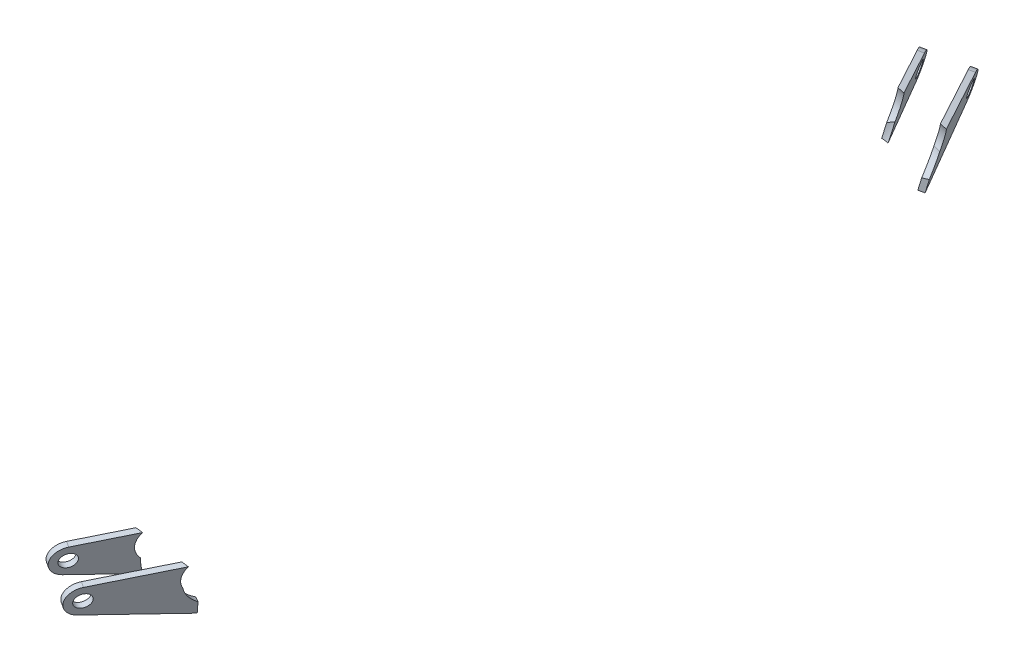
ISO-10303-21;
HEADER;
FILE_DESCRIPTION(('STEP AP214'),'2;1');
FILE_NAME('part.step','',(''),(''),'','','');
FILE_SCHEMA(('AUTOMOTIVE_DESIGN { 1 0 10303 214 1 1 1 1 }'));
ENDSEC;
DATA;
#1=APPLICATION_CONTEXT('core data for automotive mechanical design processes');
#2=APPLICATION_PROTOCOL_DEFINITION('international standard','automotive_design',2000,#1);
#3=PRODUCT_CONTEXT('',#1,'mechanical');
#4=PRODUCT('Part','Part','',(#3));
#5=PRODUCT_RELATED_PRODUCT_CATEGORY('part','',(#4));
#6=PRODUCT_DEFINITION_FORMATION('','',#4);
#7=PRODUCT_DEFINITION_CONTEXT('part definition',#1,'design');
#8=PRODUCT_DEFINITION('design','',#6,#7);
#9=PRODUCT_DEFINITION_SHAPE('','',#8);
#10=(LENGTH_UNIT() NAMED_UNIT(*) SI_UNIT(.MILLI.,.METRE.));
#11=(NAMED_UNIT(*) PLANE_ANGLE_UNIT() SI_UNIT($,.RADIAN.));
#12=(NAMED_UNIT(*) SI_UNIT($,.STERADIAN.) SOLID_ANGLE_UNIT());
#13=UNCERTAINTY_MEASURE_WITH_UNIT(LENGTH_MEASURE(1.E-05),#10,'distance_accuracy_value','');
#14=(GEOMETRIC_REPRESENTATION_CONTEXT(3) GLOBAL_UNCERTAINTY_ASSIGNED_CONTEXT((#13)) GLOBAL_UNIT_ASSIGNED_CONTEXT((#10,
#11,#12)) REPRESENTATION_CONTEXT('',''));
#15=CARTESIAN_POINT('',(0.,0.,0.));
#16=DIRECTION('',(0.,0.,1.));
#17=DIRECTION('',(1.,0.,0.));
#18=AXIS2_PLACEMENT_3D('',#15,#16,#17);
#19=CARTESIAN_POINT('',(1107.80355758936,282.911405493826,229.382502317127));
#20=DIRECTION('',(0.849703534219783,-0.242617124485415,0.468124806906063));
#21=DIRECTION('',(0.48254214233557,0.,-0.87587275381199));
#22=AXIS2_PLACEMENT_3D('',#19,#20,#21);
#23=CYLINDRICAL_SURFACE('',#22,8.00000000000001);
#24=CARTESIAN_POINT('',(1110.35266819202,282.183554120369,230.786876737845));
#25=DIRECTION('',(-0.849703534219782,0.242617124485416,-0.468124806906065));
#26=DIRECTION('',(-0.482542142335571,0.,0.875872753811989));
#27=AXIS2_PLACEMENT_3D('',#24,#25,#26);
#28=CIRCLE('',#27,8.00000000000001);
#29=CARTESIAN_POINT('',(1107.85873724563,274.605894116042,231.386357591102));
#30=VERTEX_POINT('',#29);
#31=CARTESIAN_POINT('',(1111.88115788975,289.937012839905,232.030901306901));
#32=VERTEX_POINT('',#31);
#33=EDGE_CURVE('E103',#30,#32,#28,.T.);
#34=ORIENTED_EDGE('',*,*,#33,.T.);
#35=DIRECTION('',(0.849703534219783,-0.242617124485415,0.468124806906063));
#36=VECTOR('',#35,1.);
#37=CARTESIAN_POINT('',(1109.33204728709,290.664864213361,230.626526886182));
#38=LINE('',#37,#36);
#39=CARTESIAN_POINT('',(1109.33204728709,290.664864213361,230.626526886182));
#40=VERTEX_POINT('',#39);
#41=EDGE_CURVE('E105',#40,#32,#38,.T.);
#42=ORIENTED_EDGE('',*,*,#41,.F.);
#43=CARTESIAN_POINT('',(1107.80355758936,282.911405493826,229.382502317127));
#44=DIRECTION('',(-0.849703534219782,0.242617124485416,-0.468124806906065));
#45=DIRECTION('',(-0.482542142335571,0.,0.875872753811989));
#46=AXIS2_PLACEMENT_3D('',#43,#44,#45);
#47=CIRCLE('',#46,8.00000000000001);
#48=CARTESIAN_POINT('',(1105.30962664297,275.333745489498,229.981983170384));
#49=VERTEX_POINT('',#48);
#50=EDGE_CURVE('E104',#49,#40,#47,.T.);
#51=ORIENTED_EDGE('',*,*,#50,.F.);
#52=DIRECTION('',(0.849703534219783,-0.242617124485415,0.468124806906063));
#53=VECTOR('',#52,1.);
#54=CARTESIAN_POINT('',(1105.30962664297,275.333745489498,229.981983170384));
#55=LINE('',#54,#53);
#56=EDGE_CURVE('E91',#49,#30,#55,.T.);
#57=ORIENTED_EDGE('',*,*,#56,.T.);
#58=EDGE_LOOP('',(#34,#42,#51,#57));
#59=FACE_BOUND('',#58,.T.);
#60=ADVANCED_FACE('F50',(#59),#23,.T.);
#61=CARTESIAN_POINT('',(1107.80355758936,282.911405493826,229.382502317127));
#62=DIRECTION('',(0.849703534219783,-0.242617124485415,0.468124806906063));
#63=DIRECTION('',(0.48254214233557,0.,-0.87587275381199));
#64=AXIS2_PLACEMENT_3D('',#61,#62,#63);
#65=CYLINDRICAL_SURFACE('',#64,4.1);
#66=CARTESIAN_POINT('',(1107.80355758936,282.911405493826,229.382502317127));
#67=DIRECTION('',(-0.849703534219782,0.242617124485416,-0.468124806906065));
#68=DIRECTION('',(-0.482542142335571,0.,0.875872753811989));
#69=AXIS2_PLACEMENT_3D('',#66,#67,#68);
#70=CIRCLE('',#69,4.1);
#71=CARTESIAN_POINT('',(1105.82513480579,282.911405493826,232.973580607756));
#72=VERTEX_POINT('',#71);
#73=EDGE_CURVE('E97',#72,#72,#70,.T.);
#74=ORIENTED_EDGE('',*,*,#73,.T.);
#75=EDGE_LOOP('',(#74));
#76=FACE_BOUND('',#75,.T.);
#77=CARTESIAN_POINT('',(1110.35266819202,282.183554120369,230.786876737845));
#78=DIRECTION('',(-0.849703534219782,0.242617124485416,-0.468124806906065));
#79=DIRECTION('',(-0.482542142335571,0.,0.875872753811989));
#80=AXIS2_PLACEMENT_3D('',#77,#78,#79);
#81=CIRCLE('',#80,4.1);
#82=CARTESIAN_POINT('',(1108.37424540845,282.183554120369,234.377955028474));
#83=VERTEX_POINT('',#82);
#84=EDGE_CURVE('E110',#83,#83,#81,.T.);
#85=ORIENTED_EDGE('',*,*,#84,.F.);
#86=EDGE_LOOP('',(#85));
#87=FACE_BOUND('',#86,.T.);
#88=ADVANCED_FACE('F52',(#76,#87),#65,.F.);
#89=CARTESIAN_POINT('',(933.918642447806,275.426402218324,541.125513622882));
#90=DIRECTION('',(-0.191061212215496,-0.969182339941915,-0.155503071131922));
#91=DIRECTION('',(-0.51535400454366,0.233875661315721,-0.824446738755723));
#92=AXIS2_PLACEMENT_3D('',#89,#90,#91);
#93=PLANE('',#92);
#94=CARTESIAN_POINT('',(2339.12060391884,62.0776956583833,144.311540305559));
#95=DIRECTION('',(0.191061212215496,0.969182339941915,0.155503071131922));
#96=DIRECTION('',(0.981506416473428,-0.18671975329441,-0.0422005705075714));
#97=AXIS2_PLACEMENT_3D('',#94,#95,#96);
#98=ELLIPSE('',#97,2047.60295975983,12.7);
#99=CARTESIAN_POINT('',(1126.3297099436,291.192183227583,206.455542475883));
#100=VERTEX_POINT('',#99);
#101=CARTESIAN_POINT('',(1122.91336372795,291.844696362542,206.586260423644));
#102=VERTEX_POINT('',#101);
#103=EDGE_CURVE('E126',#100,#102,#98,.F.);
#104=ORIENTED_EDGE('',*,*,#103,.T.);
#105=DIRECTION('',(0.491426003708755,0.0426910160472063,-0.869872381460465));
#106=VECTOR('',#105,1.);
#107=CARTESIAN_POINT('',(933.918642447806,275.426402218324,541.125513622882));
#108=LINE('',#107,#106);
#109=EDGE_CURVE('E141',#40,#102,#108,.T.);
#110=ORIENTED_EDGE('',*,*,#109,.F.);
#111=ORIENTED_EDGE('',*,*,#41,.T.);
#112=DIRECTION('',(0.491426003708755,0.0426910160472063,-0.869872381460465));
#113=VECTOR('',#112,1.);
#114=CARTESIAN_POINT('',(936.467753050465,274.698550844868,542.529888043601));
#115=LINE('',#114,#113);
#116=EDGE_CURVE('E98',#32,#100,#115,.T.);
#117=ORIENTED_EDGE('',*,*,#116,.T.);
#118=EDGE_LOOP('',(#104,#110,#111,#117));
#119=FACE_BOUND('',#118,.T.);
#120=ADVANCED_FACE('F125',(#119),#93,.F.);
#121=CARTESIAN_POINT('',(773.70714337,349.94360184793,209.999999999999));
#122=DIRECTION('',(0.982672570442046,-0.180704930107559,-0.0412352705295394));
#123=DIRECTION('',(0.180858756895923,0.983509079802552,0.));
#124=AXIS2_PLACEMENT_3D('',#121,#122,#123);
#125=CYLINDRICAL_SURFACE('',#124,12.7);
#126=CARTESIAN_POINT('',(1131.17026577313,284.209245875391,195.));
#127=DIRECTION('',(0.417051669287476,-0.855676898295532,-0.306406512443628));
#128=DIRECTION('',(0.908549979994918,0.383371496045263,0.166021775292435));
#129=AXIS2_PLACEMENT_3D('',#126,#127,#128);
#130=ELLIPSE('',#129,22.007155689415,12.7);
#131=CARTESIAN_POINT('',(1123.26666944262,276.913970150011,204.615301053474));
#132=VERTEX_POINT('',#131);
#133=CARTESIAN_POINT('',(1120.28212910685,275.986416561959,203.143330538669));
#134=VERTEX_POINT('',#133);
#135=EDGE_CURVE('E12',#132,#134,#130,.T.);
#136=ORIENTED_EDGE('',*,*,#135,.T.);
#137=CARTESIAN_POINT('',(1127.23212459541,284.933435750716,195.165253739377));
#138=DIRECTION('',(0.849703534219782,-0.242617124485416,0.468124806906065));
#139=DIRECTION('',(0.49370839550025,0.0544491545256872,-0.867921257824699));
#140=AXIS2_PLACEMENT_3D('',#137,#138,#139);
#141=ELLIPSE('',#140,14.7757022760264,12.7);
#142=EDGE_CURVE('E114',#134,#102,#141,.F.);
#143=ORIENTED_EDGE('',*,*,#142,.T.);
#144=ORIENTED_EDGE('',*,*,#103,.F.);
#145=CARTESIAN_POINT('',(1130.66196963533,284.302717109673,195.021329310886));
#146=DIRECTION('',(0.849703534219782,-0.242617124485416,0.468124806906065));
#147=DIRECTION('',(0.49370839550025,0.0544491545256872,-0.867921257824699));
#148=AXIS2_PLACEMENT_3D('',#145,#146,#147);
#149=ELLIPSE('',#148,14.7757022760264,12.7);
#150=EDGE_CURVE('E54',#132,#100,#149,.F.);
#151=ORIENTED_EDGE('',*,*,#150,.F.);
#152=EDGE_LOOP('',(#136,#143,#144,#151));
#153=FACE_BOUND('',#152,.T.);
#154=ADVANCED_FACE('F128',(#153),#125,.F.);
#155=CARTESIAN_POINT('',(835.2968838926,-238.503572010835,460.187791075277));
#156=DIRECTION('',(-0.849703534219782,0.242617124485416,-0.468124806906065));
#157=DIRECTION('',(-0.482542142335571,0.,0.875872753811989));
#158=AXIS2_PLACEMENT_3D('',#155,#156,#157);
#159=PLANE('',#158);
#160=ORIENTED_EDGE('',*,*,#84,.T.);
#161=EDGE_LOOP('',(#160));
#162=FACE_BOUND('',#161,.T.);
#163=CARTESIAN_POINT('',(1130.57820583632,283.256312767818,194.631046177595));
#164=DIRECTION('',(0.849703534219782,-0.242617124485416,0.468124806906065));
#165=DIRECTION('',(0.195854722962817,0.969553269268833,0.146994508548026));
#166=AXIS2_PLACEMENT_3D('',#163,#164,#165);
#167=ELLIPSE('',#166,33.7355125553886,12.7);
#168=CARTESIAN_POINT('',(1121.99795509881,267.636333238757,202.109809974439));
#169=VERTEX_POINT('',#168);
#170=EDGE_CURVE('E66',#169,#132,#167,.F.);
#171=ORIENTED_EDGE('',*,*,#170,.T.);
#172=ORIENTED_EDGE('',*,*,#150,.T.);
#173=ORIENTED_EDGE('',*,*,#116,.F.);
#174=ORIENTED_EDGE('',*,*,#33,.F.);
#175=DIRECTION('',(-0.425230788190571,0.209606492803467,0.880479355209113));
#176=VECTOR('',#175,1.);
#177=CARTESIAN_POINT('',(1018.64295583765,318.582500615348,416.115817146057));
#178=LINE('',#177,#176);
#179=EDGE_CURVE('E88',#169,#30,#178,.T.);
#180=ORIENTED_EDGE('',*,*,#179,.F.);
#181=EDGE_LOOP('',(#171,#172,#173,#174,#180));
#182=FACE_BOUND('',#181,.T.);
#183=ADVANCED_FACE('F107',(#162,#182),#159,.F.);
#184=CARTESIAN_POINT('',(832.747773289941,-237.775720637378,458.783416654559));
#185=DIRECTION('',(-0.849703534219782,0.242617124485416,-0.468124806906065));
#186=DIRECTION('',(-0.482542142335571,0.,0.875872753811989));
#187=AXIS2_PLACEMENT_3D('',#184,#185,#186);
#188=PLANE('',#187);
#189=ORIENTED_EDGE('',*,*,#73,.F.);
#190=EDGE_LOOP('',(#189));
#191=FACE_BOUND('',#190,.T.);
#192=DIRECTION('',(-0.425230788190571,0.209606492803467,0.880479355209113));
#193=VECTOR('',#192,1.);
#194=CARTESIAN_POINT('',(1016.09384523499,319.310351988804,414.711442725339));
#195=LINE('',#194,#193);
#196=CARTESIAN_POINT('',(1118.96743495081,268.601482966905,201.702238179139));
#197=VERTEX_POINT('',#196);
#198=EDGE_CURVE('E75',#197,#49,#195,.T.);
#199=ORIENTED_EDGE('',*,*,#198,.T.);
#200=ORIENTED_EDGE('',*,*,#50,.T.);
#201=ORIENTED_EDGE('',*,*,#109,.T.);
#202=ORIENTED_EDGE('',*,*,#142,.F.);
#203=CARTESIAN_POINT('',(1126.58314530644,276.826177558513,192.141445443608));
#204=DIRECTION('',(0.849703534219782,-0.242617124485416,0.468124806906065));
#205=DIRECTION('',(0.195854722962817,0.969553269268833,0.146994508548026));
#206=AXIS2_PLACEMENT_3D('',#203,#204,#205);
#207=ELLIPSE('',#206,33.7355125553886,12.7);
#208=EDGE_CURVE('E131',#197,#134,#207,.F.);
#209=ORIENTED_EDGE('',*,*,#208,.F.);
#210=EDGE_LOOP('',(#199,#200,#201,#202,#209));
#211=FACE_BOUND('',#210,.T.);
#212=ADVANCED_FACE('F142',(#191,#211),#188,.T.);
#213=CARTESIAN_POINT('',(1016.09384523499,319.310351988804,414.711442725339));
#214=DIRECTION('',(0.311741368299487,0.947207500540963,-0.0749351066570562));
#215=DIRECTION('',(0.550633493628883,-0.1158230169199,0.826672719064578));
#216=AXIS2_PLACEMENT_3D('',#213,#214,#215);
#217=PLANE('',#216);
#218=CARTESIAN_POINT('',(1120.50296248206,267.039993503082,188.352459642488));
#219=DIRECTION('',(-0.311741368299487,-0.947207500540963,0.0749351066570562));
#220=DIRECTION('',(0.501797874284253,-0.0971524805070823,0.859511657218869));
#221=AXIS2_PLACEMENT_3D('',#218,#219,#220);
#222=ELLIPSE('',#221,14.1556723375433,12.7);
#223=EDGE_CURVE('E95',#197,#169,#222,.F.);
#224=ORIENTED_EDGE('',*,*,#223,.T.);
#225=ORIENTED_EDGE('',*,*,#179,.T.);
#226=ORIENTED_EDGE('',*,*,#56,.F.);
#227=ORIENTED_EDGE('',*,*,#198,.F.);
#228=EDGE_LOOP('',(#224,#225,#226,#227));
#229=FACE_BOUND('',#228,.T.);
#230=ADVANCED_FACE('F90',(#229),#217,.F.);
#231=CARTESIAN_POINT('',(1066.45599283991,180.050242070596,154.672024944587));
#232=DIRECTION('',(0.50132402411459,0.806891719065977,0.312409949502743));
#233=DIRECTION('',(-0.849406753092849,0.527738730623652,0.));
#234=AXIS2_PLACEMENT_3D('',#231,#232,#233);
#235=CYLINDRICAL_SURFACE('',#234,12.7);
#236=ORIENTED_EDGE('',*,*,#223,.F.);
#237=ORIENTED_EDGE('',*,*,#208,.T.);
#238=ORIENTED_EDGE('',*,*,#135,.F.);
#239=ORIENTED_EDGE('',*,*,#170,.F.);
#240=EDGE_LOOP('',(#236,#237,#238,#239));
#241=FACE_BOUND('',#240,.T.);
#242=ADVANCED_FACE('F148',(#241),#235,.F.);
#243=CLOSED_SHELL('',(#60,#88,#120,#154,#183,#212,#230,#242));
#244=MANIFOLD_SOLID_BREP('B2',#243);
#245=CARTESIAN_POINT('',(853.140658111219,-243.598531625029,470.018412020306));
#246=DIRECTION('',(0.849703534219784,-0.242617124485413,0.468124806906062));
#247=DIRECTION('',(-0.482542142335568,0.,0.875872753811991));
#248=AXIS2_PLACEMENT_3D('',#245,#246,#247);
#249=PLANE('',#248);
#250=CARTESIAN_POINT('',(1128.19644241064,277.088594506176,240.617497682873));
#251=DIRECTION('',(-0.849703534219784,0.242617124485413,-0.468124806906062));
#252=DIRECTION('',(-0.482542142335568,0.,0.875872753811991));
#253=AXIS2_PLACEMENT_3D('',#250,#251,#252);
#254=CIRCLE('',#253,4.1);
#255=CARTESIAN_POINT('',(1126.21801962706,277.088594506176,244.208575973502));
#256=VERTEX_POINT('',#255);
#257=EDGE_CURVE('E329',#256,#256,#254,.T.);
#258=ORIENTED_EDGE('',*,*,#257,.T.);
#259=EDGE_LOOP('',(#258));
#260=FACE_BOUND('',#259,.T.);
#261=CARTESIAN_POINT('',(1154.67088491479,279.887686622376,194.01385831144));
#262=DIRECTION('',(-0.849703534219784,0.242617124485413,-0.468124806906062));
#263=DIRECTION('',(0.493708395500246,0.0544491545256872,-0.867921257824701));
#264=AXIS2_PLACEMENT_3D('',#261,#262,#263);
#265=ELLIPSE('',#264,14.7757022760263,12.7);
#266=CARTESIAN_POINT('',(1150.24527814496,286.624690724198,205.538490624512));
#267=VERTEX_POINT('',#266);
#268=CARTESIAN_POINT('',(1147.02345276409,274.600633899524,205.154734677295));
#269=VERTEX_POINT('',#268);
#270=EDGE_CURVE('E298',#267,#269,#265,.F.);
#271=ORIENTED_EDGE('',*,*,#270,.F.);
#272=DIRECTION('',(0.491426003708752,0.0426910160472072,-0.869872381460467));
#273=VECTOR('',#272,1.);
#274=CARTESIAN_POINT('',(954.311527269083,269.603591230674,552.360508988629));
#275=LINE('',#274,#273);
#276=CARTESIAN_POINT('',(1129.72493210836,284.842053225711,241.861522251928));
#277=VERTEX_POINT('',#276);
#278=EDGE_CURVE('E334',#277,#267,#275,.T.);
#279=ORIENTED_EDGE('',*,*,#278,.F.);
#280=CARTESIAN_POINT('',(1128.19644241064,277.088594506176,240.617497682873));
#281=DIRECTION('',(-0.849703534219784,0.242617124485413,-0.468124806906062));
#282=DIRECTION('',(-0.482542142335568,0.,0.875872753811991));
#283=AXIS2_PLACEMENT_3D('',#280,#281,#282);
#284=CIRCLE('',#283,8.00000000000001);
#285=CARTESIAN_POINT('',(1125.70251146424,269.510934501848,241.216978536129));
#286=VERTEX_POINT('',#285);
#287=EDGE_CURVE('E337',#286,#277,#284,.T.);
#288=ORIENTED_EDGE('',*,*,#287,.F.);
#289=DIRECTION('',(-0.425230788190569,0.209606492803466,0.880479355209114));
#290=VECTOR('',#289,1.);
#291=CARTESIAN_POINT('',(1036.48673005627,313.487541001154,425.946438091085));
#292=LINE('',#291,#290);
#293=CARTESIAN_POINT('',(1146.88425909788,259.069941148976,197.35822696731));
#294=VERTEX_POINT('',#293);
#295=EDGE_CURVE('E315',#294,#286,#292,.T.);
#296=ORIENTED_EDGE('',*,*,#295,.F.);
#297=DIRECTION('',(-0.201315078323357,-0.969864024604574,-0.137244355138854));
#298=VECTOR('',#297,1.);
#299=CARTESIAN_POINT('',(1044.36777392282,-234.81780798668,127.468733263551));
#300=LINE('',#299,#298);
#301=CARTESIAN_POINT('',(1148.23737088095,265.588749628712,198.280696141728));
#302=VERTEX_POINT('',#301);
#303=EDGE_CURVE('E313',#302,#294,#300,.T.);
#304=ORIENTED_EDGE('',*,*,#303,.F.);
#305=CARTESIAN_POINT('',(1154.45725470868,275.191580662407,191.967751442058));
#306=DIRECTION('',(-0.849703534219784,0.242617124485413,-0.468124806906062));
#307=DIRECTION('',(-0.401426475880869,0.277955951350828,0.872695407098331));
#308=AXIS2_PLACEMENT_3D('',#305,#306,#307);
#309=ELLIPSE('',#308,15.5421019684215,12.7);
#310=EDGE_CURVE('E316',#269,#302,#309,.F.);
#311=ORIENTED_EDGE('',*,*,#310,.F.);
#312=EDGE_LOOP('',(#271,#279,#288,#296,#304,#311));
#313=FACE_BOUND('',#312,.T.);
#314=ADVANCED_FACE('F241',(#260,#313),#249,.T.);
#315=CARTESIAN_POINT('',(850.59154750856,-242.870680251573,468.614037599588));
#316=DIRECTION('',(0.849703534219784,-0.242617124485413,0.468124806906062));
#317=DIRECTION('',(-0.482542142335568,0.,0.875872753811991));
#318=AXIS2_PLACEMENT_3D('',#315,#316,#317);
#319=PLANE('',#318);
#320=CARTESIAN_POINT('',(1125.64733180798,277.816445879632,239.213123262155));
#321=DIRECTION('',(-0.849703534219784,0.242617124485413,-0.468124806906062));
#322=DIRECTION('',(-0.482542142335568,0.,0.875872753811991));
#323=AXIS2_PLACEMENT_3D('',#320,#321,#322);
#324=CIRCLE('',#323,4.1);
#325=CARTESIAN_POINT('',(1123.6689090244,277.816445879632,242.804201552784));
#326=VERTEX_POINT('',#325);
#327=EDGE_CURVE('E331',#326,#326,#324,.T.);
#328=ORIENTED_EDGE('',*,*,#327,.F.);
#329=EDGE_LOOP('',(#328));
#330=FACE_BOUND('',#329,.T.);
#331=CARTESIAN_POINT('',(1151.05858835807,276.50768191557,192.410299045318));
#332=DIRECTION('',(-0.849703534219784,0.242617124485413,-0.468124806906062));
#333=DIRECTION('',(-0.401426475880869,0.277955951350828,0.872695407098331));
#334=AXIS2_PLACEMENT_3D('',#331,#332,#333);
#335=ELLIPSE('',#334,15.5421019684215,12.7);
#336=CARTESIAN_POINT('',(1143.58215745068,275.554789796406,205.487072010886));
#337=VERTEX_POINT('',#336);
#338=CARTESIAN_POINT('',(1145.57709569175,265.781049794606,196.800536478686));
#339=VERTEX_POINT('',#338);
#340=EDGE_CURVE('E251',#337,#339,#335,.F.);
#341=ORIENTED_EDGE('',*,*,#340,.T.);
#342=DIRECTION('',(-0.201315078323357,-0.969864024604574,-0.137244355138854));
#343=VECTOR('',#342,1.);
#344=CARTESIAN_POINT('',(1041.81866332016,-234.089956613224,126.064358842833));
#345=LINE('',#344,#343);
#346=CARTESIAN_POINT('',(1144.33514849522,259.797792522433,195.953852546592));
#347=VERTEX_POINT('',#346);
#348=EDGE_CURVE('E245',#339,#347,#345,.T.);
#349=ORIENTED_EDGE('',*,*,#348,.T.);
#350=DIRECTION('',(-0.425230788190569,0.209606492803466,0.880479355209114));
#351=VECTOR('',#350,1.);
#352=CARTESIAN_POINT('',(1033.93761945361,314.21539237461,424.542063670367));
#353=LINE('',#352,#351);
#354=CARTESIAN_POINT('',(1123.15340086158,270.238785875304,239.812604115411));
#355=VERTEX_POINT('',#354);
#356=EDGE_CURVE('E324',#347,#355,#353,.T.);
#357=ORIENTED_EDGE('',*,*,#356,.T.);
#358=CARTESIAN_POINT('',(1125.64733180798,277.816445879632,239.213123262155));
#359=DIRECTION('',(-0.849703534219784,0.242617124485413,-0.468124806906062));
#360=DIRECTION('',(-0.482542142335568,0.,0.875872753811991));
#361=AXIS2_PLACEMENT_3D('',#358,#359,#360);
#362=CIRCLE('',#361,8.00000000000001);
#363=CARTESIAN_POINT('',(1127.1758215057,285.569904599167,240.45714783121));
#364=VERTEX_POINT('',#363);
#365=EDGE_CURVE('E326',#355,#364,#362,.T.);
#366=ORIENTED_EDGE('',*,*,#365,.T.);
#367=DIRECTION('',(0.491426003708752,0.0426910160472072,-0.869872381460467));
#368=VECTOR('',#367,1.);
#369=CARTESIAN_POINT('',(951.762416666423,270.33144260413,550.956134567911));
#370=LINE('',#369,#368);
#371=CARTESIAN_POINT('',(1146.82864710023,287.277179115569,205.669712747756));
#372=VERTEX_POINT('',#371);
#373=EDGE_CURVE('E306',#364,#372,#370,.T.);
#374=ORIENTED_EDGE('',*,*,#373,.T.);
#375=CARTESIAN_POINT('',(1151.24103987487,280.518405263418,194.157782739932));
#376=DIRECTION('',(-0.849703534219784,0.242617124485413,-0.468124806906062));
#377=DIRECTION('',(0.493708395500246,0.0544491545256872,-0.867921257824701));
#378=AXIS2_PLACEMENT_3D('',#375,#376,#377);
#379=ELLIPSE('',#378,14.7757022760263,12.7);
#380=EDGE_CURVE('E295',#372,#337,#379,.F.);
#381=ORIENTED_EDGE('',*,*,#380,.T.);
#382=EDGE_LOOP('',(#341,#349,#357,#366,#374,#381));
#383=FACE_BOUND('',#382,.T.);
#384=ADVANCED_FACE('F302',(#330,#383),#319,.F.);
#385=CARTESIAN_POINT('',(1128.19644241064,277.088594506176,240.617497682873));
#386=DIRECTION('',(-0.849703534219783,0.242617124485415,-0.468124806906063));
#387=DIRECTION('',(0.48254214233557,0.,-0.87587275381199));
#388=AXIS2_PLACEMENT_3D('',#385,#386,#387);
#389=CYLINDRICAL_SURFACE('',#388,8.00000000000001);
#390=ORIENTED_EDGE('',*,*,#365,.F.);
#391=DIRECTION('',(-0.849703534219783,0.242617124485415,-0.468124806906063));
#392=VECTOR('',#391,1.);
#393=CARTESIAN_POINT('',(1125.70251146424,269.510934501848,241.216978536129));
#394=LINE('',#393,#392);
#395=EDGE_CURVE('E321',#286,#355,#394,.T.);
#396=ORIENTED_EDGE('',*,*,#395,.F.);
#397=ORIENTED_EDGE('',*,*,#287,.T.);
#398=DIRECTION('',(-0.849703534219783,0.242617124485415,-0.468124806906063));
#399=VECTOR('',#398,1.);
#400=CARTESIAN_POINT('',(1129.72493210836,284.842053225711,241.861522251928));
#401=LINE('',#400,#399);
#402=EDGE_CURVE('E319',#277,#364,#401,.T.);
#403=ORIENTED_EDGE('',*,*,#402,.T.);
#404=EDGE_LOOP('',(#390,#396,#397,#403));
#405=FACE_BOUND('',#404,.T.);
#406=ADVANCED_FACE('F353',(#405),#389,.T.);
#407=CARTESIAN_POINT('',(954.311527269083,269.603591230674,552.360508988629));
#408=DIRECTION('',(-0.191061212215496,-0.969182339941915,-0.155503071131921));
#409=DIRECTION('',(0.98111722996899,-0.193414014636935,0.));
#410=AXIS2_PLACEMENT_3D('',#407,#408,#409);
#411=PLANE('',#410);
#412=CARTESIAN_POINT('',(2339.12060391857,62.0776956584331,144.311540305582));
#413=DIRECTION('',(0.191061212215496,0.969182339941915,0.155503071131921));
#414=DIRECTION('',(0.981506416473428,-0.186719753294412,-0.0422005705075602));
#415=AXIS2_PLACEMENT_3D('',#412,#413,#414);
#416=ELLIPSE('',#415,2047.60295975928,12.7);
#417=EDGE_CURVE('E307',#267,#372,#416,.F.);
#418=ORIENTED_EDGE('',*,*,#417,.T.);
#419=ORIENTED_EDGE('',*,*,#373,.F.);
#420=ORIENTED_EDGE('',*,*,#402,.F.);
#421=ORIENTED_EDGE('',*,*,#278,.T.);
#422=EDGE_LOOP('',(#418,#419,#420,#421));
#423=FACE_BOUND('',#422,.T.);
#424=ADVANCED_FACE('F356',(#423),#411,.F.);
#425=CARTESIAN_POINT('',(1044.36777392282,-234.81780798668,127.468733263551));
#426=DIRECTION('',(-0.487315240038797,-0.0223764314457993,0.872939374837498));
#427=DIRECTION('',(-0.873157999357688,0.,-0.487437286384289));
#428=AXIS2_PLACEMENT_3D('',#425,#426,#427);
#429=PLANE('',#428);
#430=CARTESIAN_POINT('',(1139.67339373794,280.916490360195,193.892789549535));
#431=DIRECTION('',(0.487315240038797,0.0223764314457993,-0.872939374837498));
#432=DIRECTION('',(-0.787448879258255,0.443335682629701,-0.428226266198344));
#433=AXIS2_PLACEMENT_3D('',#430,#431,#432);
#434=ELLIPSE('',#433,23.1615664398484,12.7);
#435=EDGE_CURVE('E48',#339,#302,#434,.F.);
#436=ORIENTED_EDGE('',*,*,#435,.T.);
#437=ORIENTED_EDGE('',*,*,#303,.T.);
#438=DIRECTION('',(-0.849703534219783,0.242617124485415,-0.468124806906063));
#439=VECTOR('',#438,1.);
#440=CARTESIAN_POINT('',(1146.88425909788,259.069941148976,197.35822696731));
#441=LINE('',#440,#439);
#442=EDGE_CURVE('E322',#294,#347,#441,.T.);
#443=ORIENTED_EDGE('',*,*,#442,.T.);
#444=ORIENTED_EDGE('',*,*,#348,.F.);
#445=EDGE_LOOP('',(#436,#437,#443,#444));
#446=FACE_BOUND('',#445,.T.);
#447=ADVANCED_FACE('F243',(#446),#429,.F.);
#448=CARTESIAN_POINT('',(1128.19644241064,277.088594506176,240.617497682873));
#449=DIRECTION('',(-0.849703534219783,0.242617124485415,-0.468124806906063));
#450=DIRECTION('',(0.48254214233557,0.,-0.87587275381199));
#451=AXIS2_PLACEMENT_3D('',#448,#449,#450);
#452=CYLINDRICAL_SURFACE('',#451,4.1);
#453=ORIENTED_EDGE('',*,*,#257,.F.);
#454=EDGE_LOOP('',(#453));
#455=FACE_BOUND('',#454,.T.);
#456=ORIENTED_EDGE('',*,*,#327,.T.);
#457=EDGE_LOOP('',(#456));
#458=FACE_BOUND('',#457,.T.);
#459=ADVANCED_FACE('F370',(#455,#458),#452,.F.);
#460=CARTESIAN_POINT('',(1036.48673005627,313.487541001154,425.946438091085));
#461=DIRECTION('',(0.311741368299487,0.947207500540963,-0.0749351066570562));
#462=DIRECTION('',(-0.949878166231099,0.312620327741888,0.));
#463=AXIS2_PLACEMENT_3D('',#460,#461,#462);
#464=PLANE('',#463);
#465=ORIENTED_EDGE('',*,*,#356,.F.);
#466=ORIENTED_EDGE('',*,*,#442,.F.);
#467=ORIENTED_EDGE('',*,*,#295,.T.);
#468=ORIENTED_EDGE('',*,*,#395,.T.);
#469=EDGE_LOOP('',(#465,#466,#467,#468));
#470=FACE_BOUND('',#469,.T.);
#471=ADVANCED_FACE('F349',(#470),#464,.F.);
#472=CARTESIAN_POINT('',(1131.17026577313,284.209245875391,195.));
#473=DIRECTION('',(0.982672570442047,-0.180704930107559,-0.0412352705295279));
#474=DIRECTION('',(0.180858756895923,0.983509079802552,0.));
#475=AXIS2_PLACEMENT_3D('',#472,#473,#474);
#476=CYLINDRICAL_SURFACE('',#475,12.7);
#477=CARTESIAN_POINT('',(1131.17026577313,284.20924587539,195.));
#478=DIRECTION('',(-0.280787821812712,-0.876507990822017,-0.39101399098603));
#479=DIRECTION('',(-0.959142600312061,0.270988271857973,0.0813070032779909));
#480=AXIS2_PLACEMENT_3D('',#477,#478,#479);
#481=ELLIPSE('',#480,125.234682287723,12.7);
#482=EDGE_CURVE('E260',#269,#337,#481,.T.);
#483=ORIENTED_EDGE('',*,*,#482,.T.);
#484=ORIENTED_EDGE('',*,*,#380,.F.);
#485=ORIENTED_EDGE('',*,*,#417,.F.);
#486=ORIENTED_EDGE('',*,*,#270,.T.);
#487=EDGE_LOOP('',(#483,#484,#485,#486));
#488=FACE_BOUND('',#487,.T.);
#489=ADVANCED_FACE('F294',(#488),#476,.F.);
#490=CARTESIAN_POINT('',(1400.,180.10748547765,159.995106228736));
#491=DIRECTION('',(-0.925723404733642,0.358477593080664,0.120540421384069));
#492=DIRECTION('',(-0.361110660409247,-0.932522970729835,0.));
#493=AXIS2_PLACEMENT_3D('',#490,#491,#492);
#494=CYLINDRICAL_SURFACE('',#493,12.7);
#495=ORIENTED_EDGE('',*,*,#482,.F.);
#496=ORIENTED_EDGE('',*,*,#310,.T.);
#497=ORIENTED_EDGE('',*,*,#435,.F.);
#498=ORIENTED_EDGE('',*,*,#340,.F.);
#499=EDGE_LOOP('',(#495,#496,#497,#498));
#500=FACE_BOUND('',#499,.T.);
#501=ADVANCED_FACE('F309',(#500),#494,.F.);
#502=CLOSED_SHELL('',(#314,#384,#406,#424,#447,#459,#471,#489,#501));
#503=MANIFOLD_SOLID_BREP('B6',#502);
#504=CARTESIAN_POINT('',(853.140658111219,-243.598531625029,-470.018412020306));
#505=DIRECTION('',(0.849703534219784,-0.242617124485413,-0.468124806906062));
#506=DIRECTION('',(-0.482542142335568,0.,-0.875872753811991));
#507=AXIS2_PLACEMENT_3D('',#504,#505,#506);
#508=PLANE('',#507);
#509=CARTESIAN_POINT('',(1128.19644241064,277.088594506176,-240.617497682873));
#510=DIRECTION('',(0.849703534219784,-0.242617124485413,-0.468124806906062));
#511=DIRECTION('',(-0.482542142335568,0.,-0.875872753811991));
#512=AXIS2_PLACEMENT_3D('',#509,#510,#511);
#513=CIRCLE('',#512,4.1);
#514=CARTESIAN_POINT('',(1126.21801962706,277.088594506176,-244.208575973502));
#515=VERTEX_POINT('',#514);
#516=EDGE_CURVE('E547',#515,#515,#513,.T.);
#517=ORIENTED_EDGE('',*,*,#516,.F.);
#518=EDGE_LOOP('',(#517));
#519=FACE_BOUND('',#518,.T.);
#520=CARTESIAN_POINT('',(1154.67088491479,279.887686622376,-194.01385831144));
#521=DIRECTION('',(0.849703534219784,-0.242617124485413,-0.468124806906062));
#522=DIRECTION('',(0.493708395500246,0.0544491545256872,0.867921257824701));
#523=AXIS2_PLACEMENT_3D('',#520,#521,#522);
#524=ELLIPSE('',#523,14.7757022760263,12.7);
#525=CARTESIAN_POINT('',(1150.24527814496,286.624690724198,-205.538490624512));
#526=VERTEX_POINT('',#525);
#527=CARTESIAN_POINT('',(1147.02345276409,274.600633899524,-205.154734677295));
#528=VERTEX_POINT('',#527);
#529=EDGE_CURVE('E529',#526,#528,#524,.F.);
#530=ORIENTED_EDGE('',*,*,#529,.T.);
#531=CARTESIAN_POINT('',(1154.45725470868,275.191580662407,-191.967751442058));
#532=DIRECTION('',(0.849703534219784,-0.242617124485413,-0.468124806906062));
#533=DIRECTION('',(-0.401426475880869,0.277955951350828,-0.872695407098331));
#534=AXIS2_PLACEMENT_3D('',#531,#532,#533);
#535=ELLIPSE('',#534,15.5421019684215,12.7);
#536=CARTESIAN_POINT('',(1148.23737088095,265.588749628712,-198.280696141728));
#537=VERTEX_POINT('',#536);
#538=EDGE_CURVE('E475',#528,#537,#535,.F.);
#539=ORIENTED_EDGE('',*,*,#538,.T.);
#540=DIRECTION('',(-0.201315078323357,-0.969864024604574,0.137244355138854));
#541=VECTOR('',#540,1.);
#542=CARTESIAN_POINT('',(1044.36777392282,-234.81780798668,-127.468733263551));
#543=LINE('',#542,#541);
#544=CARTESIAN_POINT('',(1146.88425909788,259.069941148976,-197.35822696731));
#545=VERTEX_POINT('',#544);
#546=EDGE_CURVE('E527',#537,#545,#543,.T.);
#547=ORIENTED_EDGE('',*,*,#546,.T.);
#548=DIRECTION('',(-0.425230788190569,0.209606492803466,-0.880479355209114));
#549=VECTOR('',#548,1.);
#550=CARTESIAN_POINT('',(1036.48673005627,313.487541001154,-425.946438091085));
#551=LINE('',#550,#549);
#552=CARTESIAN_POINT('',(1125.70251146424,269.510934501848,-241.216978536129));
#553=VERTEX_POINT('',#552);
#554=EDGE_CURVE('E528',#545,#553,#551,.T.);
#555=ORIENTED_EDGE('',*,*,#554,.T.);
#556=CARTESIAN_POINT('',(1128.19644241064,277.088594506176,-240.617497682873));
#557=DIRECTION('',(0.849703534219784,-0.242617124485413,-0.468124806906062));
#558=DIRECTION('',(-0.482542142335568,0.,-0.875872753811991));
#559=AXIS2_PLACEMENT_3D('',#556,#557,#558);
#560=CIRCLE('',#559,8.00000000000001);
#561=CARTESIAN_POINT('',(1129.72493210836,284.842053225711,-241.861522251928));
#562=VERTEX_POINT('',#561);
#563=EDGE_CURVE('E555',#553,#562,#560,.T.);
#564=ORIENTED_EDGE('',*,*,#563,.T.);
#565=DIRECTION('',(0.491426003708752,0.0426910160472072,0.869872381460467));
#566=VECTOR('',#565,1.);
#567=CARTESIAN_POINT('',(954.311527269083,269.603591230674,-552.360508988629));
#568=LINE('',#567,#566);
#569=EDGE_CURVE('E553',#562,#526,#568,.T.);
#570=ORIENTED_EDGE('',*,*,#569,.T.);
#571=EDGE_LOOP('',(#530,#539,#547,#555,#564,#570));
#572=FACE_BOUND('',#571,.T.);
#573=ADVANCED_FACE('F457',(#519,#572),#508,.T.);
#574=CARTESIAN_POINT('',(850.59154750856,-242.870680251573,-468.614037599588));
#575=DIRECTION('',(0.849703534219784,-0.242617124485413,-0.468124806906062));
#576=DIRECTION('',(-0.482542142335568,0.,-0.875872753811991));
#577=AXIS2_PLACEMENT_3D('',#574,#575,#576);
#578=PLANE('',#577);
#579=CARTESIAN_POINT('',(1125.64733180798,277.816445879632,-239.213123262155));
#580=DIRECTION('',(0.849703534219784,-0.242617124485413,-0.468124806906062));
#581=DIRECTION('',(-0.482542142335568,0.,-0.875872753811991));
#582=AXIS2_PLACEMENT_3D('',#579,#580,#581);
#583=CIRCLE('',#582,4.1);
#584=CARTESIAN_POINT('',(1123.6689090244,277.816445879632,-242.804201552784));
#585=VERTEX_POINT('',#584);
#586=EDGE_CURVE('E550',#585,#585,#583,.T.);
#587=ORIENTED_EDGE('',*,*,#586,.T.);
#588=EDGE_LOOP('',(#587));
#589=FACE_BOUND('',#588,.T.);
#590=CARTESIAN_POINT('',(1151.05858835807,276.50768191557,-192.410299045318));
#591=DIRECTION('',(0.849703534219784,-0.242617124485413,-0.468124806906062));
#592=DIRECTION('',(-0.401426475880869,0.277955951350828,-0.872695407098331));
#593=AXIS2_PLACEMENT_3D('',#590,#591,#592);
#594=ELLIPSE('',#593,15.5421019684215,12.7);
#595=CARTESIAN_POINT('',(1143.58215745068,275.554789796406,-205.487072010886));
#596=VERTEX_POINT('',#595);
#597=CARTESIAN_POINT('',(1145.57709569175,265.781049794606,-196.800536478686));
#598=VERTEX_POINT('',#597);
#599=EDGE_CURVE('E467',#596,#598,#594,.F.);
#600=ORIENTED_EDGE('',*,*,#599,.F.);
#601=CARTESIAN_POINT('',(1151.24103987487,280.518405263418,-194.157782739932));
#602=DIRECTION('',(0.849703534219784,-0.242617124485413,-0.468124806906062));
#603=DIRECTION('',(0.493708395500246,0.0544491545256872,0.867921257824701));
#604=AXIS2_PLACEMENT_3D('',#601,#602,#603);
#605=ELLIPSE('',#604,14.7757022760263,12.7);
#606=CARTESIAN_POINT('',(1146.82864710023,287.277179115569,-205.669712747756));
#607=VERTEX_POINT('',#606);
#608=EDGE_CURVE('E511',#607,#596,#605,.F.);
#609=ORIENTED_EDGE('',*,*,#608,.F.);
#610=DIRECTION('',(0.491426003708752,0.0426910160472072,0.869872381460467));
#611=VECTOR('',#610,1.);
#612=CARTESIAN_POINT('',(951.762416666423,270.33144260413,-550.956134567911));
#613=LINE('',#612,#611);
#614=CARTESIAN_POINT('',(1127.1758215057,285.569904599167,-240.45714783121));
#615=VERTEX_POINT('',#614);
#616=EDGE_CURVE('E538',#615,#607,#613,.T.);
#617=ORIENTED_EDGE('',*,*,#616,.F.);
#618=CARTESIAN_POINT('',(1125.64733180798,277.816445879632,-239.213123262155));
#619=DIRECTION('',(0.849703534219784,-0.242617124485413,-0.468124806906062));
#620=DIRECTION('',(-0.482542142335568,0.,-0.875872753811991));
#621=AXIS2_PLACEMENT_3D('',#618,#619,#620);
#622=CIRCLE('',#621,8.00000000000001);
#623=CARTESIAN_POINT('',(1123.15340086158,270.238785875304,-239.812604115411));
#624=VERTEX_POINT('',#623);
#625=EDGE_CURVE('E545',#624,#615,#622,.T.);
#626=ORIENTED_EDGE('',*,*,#625,.F.);
#627=DIRECTION('',(-0.425230788190569,0.209606492803466,-0.880479355209114));
#628=VECTOR('',#627,1.);
#629=CARTESIAN_POINT('',(1033.93761945361,314.21539237461,-424.542063670367));
#630=LINE('',#629,#628);
#631=CARTESIAN_POINT('',(1144.33514849522,259.797792522433,-195.953852546592));
#632=VERTEX_POINT('',#631);
#633=EDGE_CURVE('E542',#632,#624,#630,.T.);
#634=ORIENTED_EDGE('',*,*,#633,.F.);
#635=DIRECTION('',(-0.201315078323357,-0.969864024604574,0.137244355138854));
#636=VECTOR('',#635,1.);
#637=CARTESIAN_POINT('',(1041.81866332016,-234.089956613224,-126.064358842833));
#638=LINE('',#637,#636);
#639=EDGE_CURVE('E461',#598,#632,#638,.T.);
#640=ORIENTED_EDGE('',*,*,#639,.F.);
#641=EDGE_LOOP('',(#600,#609,#617,#626,#634,#640));
#642=FACE_BOUND('',#641,.T.);
#643=ADVANCED_FACE('F516',(#589,#642),#578,.F.);
#644=CARTESIAN_POINT('',(1128.19644241064,277.088594506176,-240.617497682873));
#645=DIRECTION('',(-0.849703534219783,0.242617124485415,0.468124806906063));
#646=DIRECTION('',(0.48254214233557,0.,0.87587275381199));
#647=AXIS2_PLACEMENT_3D('',#644,#645,#646);
#648=CYLINDRICAL_SURFACE('',#647,8.00000000000001);
#649=ORIENTED_EDGE('',*,*,#625,.T.);
#650=DIRECTION('',(-0.849703534219783,0.242617124485415,0.468124806906063));
#651=VECTOR('',#650,1.);
#652=CARTESIAN_POINT('',(1129.72493210836,284.842053225711,-241.861522251928));
#653=LINE('',#652,#651);
#654=EDGE_CURVE('E535',#562,#615,#653,.T.);
#655=ORIENTED_EDGE('',*,*,#654,.F.);
#656=ORIENTED_EDGE('',*,*,#563,.F.);
#657=DIRECTION('',(-0.849703534219783,0.242617124485415,0.468124806906063));
#658=VECTOR('',#657,1.);
#659=CARTESIAN_POINT('',(1125.70251146424,269.510934501848,-241.216978536129));
#660=LINE('',#659,#658);
#661=EDGE_CURVE('E539',#553,#624,#660,.T.);
#662=ORIENTED_EDGE('',*,*,#661,.T.);
#663=EDGE_LOOP('',(#649,#655,#656,#662));
#664=FACE_BOUND('',#663,.T.);
#665=ADVANCED_FACE('F571',(#664),#648,.T.);
#666=CARTESIAN_POINT('',(954.311527269083,269.603591230674,-552.360508988629));
#667=DIRECTION('',(-0.191061212215496,-0.969182339941915,0.155503071131921));
#668=DIRECTION('',(0.98111722996899,-0.193414014636935,0.));
#669=AXIS2_PLACEMENT_3D('',#666,#667,#668);
#670=PLANE('',#669);
#671=CARTESIAN_POINT('',(2339.12060391857,62.0776956584331,-144.311540305582));
#672=DIRECTION('',(-0.191061212215496,-0.969182339941915,0.155503071131921));
#673=DIRECTION('',(0.981506416473428,-0.186719753294412,0.0422005705075602));
#674=AXIS2_PLACEMENT_3D('',#671,#672,#673);
#675=ELLIPSE('',#674,2047.60295975928,12.7);
#676=EDGE_CURVE('E522',#526,#607,#675,.F.);
#677=ORIENTED_EDGE('',*,*,#676,.F.);
#678=ORIENTED_EDGE('',*,*,#569,.F.);
#679=ORIENTED_EDGE('',*,*,#654,.T.);
#680=ORIENTED_EDGE('',*,*,#616,.T.);
#681=EDGE_LOOP('',(#677,#678,#679,#680));
#682=FACE_BOUND('',#681,.T.);
#683=ADVANCED_FACE('F573',(#682),#670,.F.);
#684=CARTESIAN_POINT('',(1044.36777392282,-234.81780798668,-127.468733263551));
#685=DIRECTION('',(-0.487315240038797,-0.0223764314457993,-0.872939374837498));
#686=DIRECTION('',(-0.873157999357688,0.,0.487437286384289));
#687=AXIS2_PLACEMENT_3D('',#684,#685,#686);
#688=PLANE('',#687);
#689=CARTESIAN_POINT('',(1139.67339373794,280.916490360195,-193.892789549535));
#690=DIRECTION('',(-0.487315240038797,-0.0223764314457993,-0.872939374837498));
#691=DIRECTION('',(-0.787448879258255,0.443335682629701,0.428226266198344));
#692=AXIS2_PLACEMENT_3D('',#689,#690,#691);
#693=ELLIPSE('',#692,23.1615664398484,12.7);
#694=EDGE_CURVE('E239',#598,#537,#693,.F.);
#695=ORIENTED_EDGE('',*,*,#694,.F.);
#696=ORIENTED_EDGE('',*,*,#639,.T.);
#697=DIRECTION('',(-0.849703534219783,0.242617124485415,0.468124806906063));
#698=VECTOR('',#697,1.);
#699=CARTESIAN_POINT('',(1146.88425909788,259.069941148976,-197.35822696731));
#700=LINE('',#699,#698);
#701=EDGE_CURVE('E524',#545,#632,#700,.T.);
#702=ORIENTED_EDGE('',*,*,#701,.F.);
#703=ORIENTED_EDGE('',*,*,#546,.F.);
#704=EDGE_LOOP('',(#695,#696,#702,#703));
#705=FACE_BOUND('',#704,.T.);
#706=ADVANCED_FACE('F459',(#705),#688,.F.);
#707=CARTESIAN_POINT('',(1128.19644241064,277.088594506176,-240.617497682873));
#708=DIRECTION('',(-0.849703534219783,0.242617124485415,0.468124806906063));
#709=DIRECTION('',(0.48254214233557,0.,0.87587275381199));
#710=AXIS2_PLACEMENT_3D('',#707,#708,#709);
#711=CYLINDRICAL_SURFACE('',#710,4.1);
#712=ORIENTED_EDGE('',*,*,#516,.T.);
#713=EDGE_LOOP('',(#712));
#714=FACE_BOUND('',#713,.T.);
#715=ORIENTED_EDGE('',*,*,#586,.F.);
#716=EDGE_LOOP('',(#715));
#717=FACE_BOUND('',#716,.T.);
#718=ADVANCED_FACE('F580',(#714,#717),#711,.F.);
#719=CARTESIAN_POINT('',(1036.48673005627,313.487541001154,-425.946438091085));
#720=DIRECTION('',(0.311741368299487,0.947207500540963,0.0749351066570562));
#721=DIRECTION('',(-0.949878166231099,0.312620327741888,0.));
#722=AXIS2_PLACEMENT_3D('',#719,#720,#721);
#723=PLANE('',#722);
#724=ORIENTED_EDGE('',*,*,#633,.T.);
#725=ORIENTED_EDGE('',*,*,#661,.F.);
#726=ORIENTED_EDGE('',*,*,#554,.F.);
#727=ORIENTED_EDGE('',*,*,#701,.T.);
#728=EDGE_LOOP('',(#724,#725,#726,#727));
#729=FACE_BOUND('',#728,.T.);
#730=ADVANCED_FACE('F566',(#729),#723,.F.);
#731=CARTESIAN_POINT('',(1131.17026577313,284.209245875391,-195.));
#732=DIRECTION('',(0.982672570442047,-0.180704930107559,0.0412352705295279));
#733=DIRECTION('',(0.180858756895923,0.983509079802552,0.));
#734=AXIS2_PLACEMENT_3D('',#731,#732,#733);
#735=CYLINDRICAL_SURFACE('',#734,12.7);
#736=CARTESIAN_POINT('',(1131.17026577313,284.20924587539,-195.));
#737=DIRECTION('',(0.280787821812712,0.876507990822017,-0.39101399098603));
#738=DIRECTION('',(-0.959142600312061,0.270988271857973,-0.0813070032779909));
#739=AXIS2_PLACEMENT_3D('',#736,#737,#738);
#740=ELLIPSE('',#739,125.234682287723,12.7);
#741=EDGE_CURVE('E506',#528,#596,#740,.T.);
#742=ORIENTED_EDGE('',*,*,#741,.F.);
#743=ORIENTED_EDGE('',*,*,#529,.F.);
#744=ORIENTED_EDGE('',*,*,#676,.T.);
#745=ORIENTED_EDGE('',*,*,#608,.T.);
#746=EDGE_LOOP('',(#742,#743,#744,#745));
#747=FACE_BOUND('',#746,.T.);
#748=ADVANCED_FACE('F520',(#747),#735,.F.);
#749=CARTESIAN_POINT('',(1400.,180.10748547765,-159.995106228736));
#750=DIRECTION('',(-0.925723404733642,0.358477593080664,-0.120540421384069));
#751=DIRECTION('',(-0.361110660409247,-0.932522970729835,0.));
#752=AXIS2_PLACEMENT_3D('',#749,#750,#751);
#753=CYLINDRICAL_SURFACE('',#752,12.7);
#754=ORIENTED_EDGE('',*,*,#741,.T.);
#755=ORIENTED_EDGE('',*,*,#599,.T.);
#756=ORIENTED_EDGE('',*,*,#694,.T.);
#757=ORIENTED_EDGE('',*,*,#538,.F.);
#758=EDGE_LOOP('',(#754,#755,#756,#757));
#759=FACE_BOUND('',#758,.T.);
#760=ADVANCED_FACE('F507',(#759),#753,.F.);
#761=CLOSED_SHELL('',(#573,#643,#665,#683,#706,#718,#730,#748,#760));
#762=MANIFOLD_SOLID_BREP('B42',#761);
#763=CARTESIAN_POINT('',(1107.80355758936,282.911405493826,-229.382502317127));
#764=DIRECTION('',(0.849703534219783,-0.242617124485415,-0.468124806906063));
#765=DIRECTION('',(0.48254214233557,0.,0.87587275381199));
#766=AXIS2_PLACEMENT_3D('',#763,#764,#765);
#767=CYLINDRICAL_SURFACE('',#766,8.00000000000001);
#768=CARTESIAN_POINT('',(1110.35266819202,282.183554120369,-230.786876737845));
#769=DIRECTION('',(0.849703534219782,-0.242617124485416,-0.468124806906065));
#770=DIRECTION('',(-0.482542142335571,0.,-0.875872753811989));
#771=AXIS2_PLACEMENT_3D('',#768,#769,#770);
#772=CIRCLE('',#771,8.00000000000001);
#773=CARTESIAN_POINT('',(1107.85873724563,274.605894116042,-231.386357591102));
#774=VERTEX_POINT('',#773);
#775=CARTESIAN_POINT('',(1111.88115788975,289.937012839905,-232.030901306901));
#776=VERTEX_POINT('',#775);
#777=EDGE_CURVE('E706',#774,#776,#772,.T.);
#778=ORIENTED_EDGE('',*,*,#777,.F.);
#779=DIRECTION('',(0.849703534219783,-0.242617124485415,-0.468124806906063));
#780=VECTOR('',#779,1.);
#781=CARTESIAN_POINT('',(1105.30962664297,275.333745489498,-229.981983170384));
#782=LINE('',#781,#780);
#783=CARTESIAN_POINT('',(1105.30962664297,275.333745489498,-229.981983170384));
#784=VERTEX_POINT('',#783);
#785=EDGE_CURVE('E713',#784,#774,#782,.T.);
#786=ORIENTED_EDGE('',*,*,#785,.F.);
#787=CARTESIAN_POINT('',(1107.80355758936,282.911405493826,-229.382502317127));
#788=DIRECTION('',(0.849703534219782,-0.242617124485416,-0.468124806906065));
#789=DIRECTION('',(-0.482542142335571,0.,-0.875872753811989));
#790=AXIS2_PLACEMENT_3D('',#787,#788,#789);
#791=CIRCLE('',#790,8.00000000000001);
#792=CARTESIAN_POINT('',(1109.33204728709,290.664864213361,-230.626526886182));
#793=VERTEX_POINT('',#792);
#794=EDGE_CURVE('E753',#784,#793,#791,.T.);
#795=ORIENTED_EDGE('',*,*,#794,.T.);
#796=DIRECTION('',(0.849703534219783,-0.242617124485415,-0.468124806906063));
#797=VECTOR('',#796,1.);
#798=CARTESIAN_POINT('',(1109.33204728709,290.664864213361,-230.626526886182));
#799=LINE('',#798,#797);
#800=EDGE_CURVE('E717',#793,#776,#799,.T.);
#801=ORIENTED_EDGE('',*,*,#800,.T.);
#802=EDGE_LOOP('',(#778,#786,#795,#801));
#803=FACE_BOUND('',#802,.T.);
#804=ADVANCED_FACE('F664',(#803),#767,.T.);
#805=CARTESIAN_POINT('',(1107.80355758936,282.911405493826,-229.382502317127));
#806=DIRECTION('',(0.849703534219783,-0.242617124485415,-0.468124806906063));
#807=DIRECTION('',(0.48254214233557,0.,0.87587275381199));
#808=AXIS2_PLACEMENT_3D('',#805,#806,#807);
#809=CYLINDRICAL_SURFACE('',#808,4.1);
#810=CARTESIAN_POINT('',(1107.80355758936,282.911405493826,-229.382502317127));
#811=DIRECTION('',(0.849703534219782,-0.242617124485416,-0.468124806906065));
#812=DIRECTION('',(-0.482542142335571,0.,-0.875872753811989));
#813=AXIS2_PLACEMENT_3D('',#810,#811,#812);
#814=CIRCLE('',#813,4.1);
#815=CARTESIAN_POINT('',(1105.82513480579,282.911405493826,-232.973580607756));
#816=VERTEX_POINT('',#815);
#817=EDGE_CURVE('E709',#816,#816,#814,.T.);
#818=ORIENTED_EDGE('',*,*,#817,.F.);
#819=EDGE_LOOP('',(#818));
#820=FACE_BOUND('',#819,.T.);
#821=CARTESIAN_POINT('',(1110.35266819202,282.183554120369,-230.786876737845));
#822=DIRECTION('',(0.849703534219782,-0.242617124485416,-0.468124806906065));
#823=DIRECTION('',(-0.482542142335571,0.,-0.875872753811989));
#824=AXIS2_PLACEMENT_3D('',#821,#822,#823);
#825=CIRCLE('',#824,4.1);
#826=CARTESIAN_POINT('',(1108.37424540845,282.183554120369,-234.377955028474));
#827=VERTEX_POINT('',#826);
#828=EDGE_CURVE('E721',#827,#827,#825,.T.);
#829=ORIENTED_EDGE('',*,*,#828,.T.);
#830=EDGE_LOOP('',(#829));
#831=FACE_BOUND('',#830,.T.);
#832=ADVANCED_FACE('F666',(#820,#831),#809,.F.);
#833=CARTESIAN_POINT('',(933.918642447806,275.426402218324,-541.125513622882));
#834=DIRECTION('',(-0.191061212215496,-0.969182339941915,0.155503071131922));
#835=DIRECTION('',(-0.51535400454366,0.233875661315721,0.824446738755723));
#836=AXIS2_PLACEMENT_3D('',#833,#834,#835);
#837=PLANE('',#836);
#838=CARTESIAN_POINT('',(2339.12060391884,62.0776956583833,-144.311540305559));
#839=DIRECTION('',(-0.191061212215496,-0.969182339941915,0.155503071131922));
#840=DIRECTION('',(0.981506416473428,-0.18671975329441,0.0422005705075714));
#841=AXIS2_PLACEMENT_3D('',#838,#839,#840);
#842=ELLIPSE('',#841,2047.60295975983,12.7);
#843=CARTESIAN_POINT('',(1126.3297099436,291.192183227583,-206.455542475883));
#844=VERTEX_POINT('',#843);
#845=CARTESIAN_POINT('',(1122.91336372795,291.844696362542,-206.586260423644));
#846=VERTEX_POINT('',#845);
#847=EDGE_CURVE('E735',#844,#846,#842,.F.);
#848=ORIENTED_EDGE('',*,*,#847,.F.);
#849=DIRECTION('',(0.491426003708755,0.0426910160472063,0.869872381460465));
#850=VECTOR('',#849,1.);
#851=CARTESIAN_POINT('',(936.467753050465,274.698550844868,-542.529888043601));
#852=LINE('',#851,#850);
#853=EDGE_CURVE('E710',#776,#844,#852,.T.);
#854=ORIENTED_EDGE('',*,*,#853,.F.);
#855=ORIENTED_EDGE('',*,*,#800,.F.);
#856=DIRECTION('',(0.491426003708755,0.0426910160472063,0.869872381460465));
#857=VECTOR('',#856,1.);
#858=CARTESIAN_POINT('',(933.918642447806,275.426402218324,-541.125513622882));
#859=LINE('',#858,#857);
#860=EDGE_CURVE('E741',#793,#846,#859,.T.);
#861=ORIENTED_EDGE('',*,*,#860,.T.);
#862=EDGE_LOOP('',(#848,#854,#855,#861));
#863=FACE_BOUND('',#862,.T.);
#864=ADVANCED_FACE('F740',(#863),#837,.F.);
#865=CARTESIAN_POINT('',(773.70714337,349.94360184793,-209.999999999999));
#866=DIRECTION('',(0.982672570442046,-0.180704930107559,0.0412352705295394));
#867=DIRECTION('',(0.180858756895923,0.983509079802552,0.));
#868=AXIS2_PLACEMENT_3D('',#865,#866,#867);
#869=CYLINDRICAL_SURFACE('',#868,12.7);
#870=CARTESIAN_POINT('',(1131.17026577313,284.209245875391,-195.));
#871=DIRECTION('',(-0.417051669287476,0.855676898295532,-0.306406512443628));
#872=DIRECTION('',(0.908549979994918,0.383371496045263,-0.166021775292435));
#873=AXIS2_PLACEMENT_3D('',#870,#871,#872);
#874=ELLIPSE('',#873,22.007155689415,12.7);
#875=CARTESIAN_POINT('',(1123.26666944262,276.913970150011,-204.615301053474));
#876=VERTEX_POINT('',#875);
#877=CARTESIAN_POINT('',(1120.28212910685,275.986416561959,-203.143330538669));
#878=VERTEX_POINT('',#877);
#879=EDGE_CURVE('E455',#876,#878,#874,.T.);
#880=ORIENTED_EDGE('',*,*,#879,.F.);
#881=CARTESIAN_POINT('',(1130.66196963533,284.302717109673,-195.021329310886));
#882=DIRECTION('',(-0.849703534219782,0.242617124485416,0.468124806906065));
#883=DIRECTION('',(0.49370839550025,0.0544491545256872,0.867921257824699));
#884=AXIS2_PLACEMENT_3D('',#881,#882,#883);
#885=ELLIPSE('',#884,14.7757022760264,12.7);
#886=EDGE_CURVE('E668',#876,#844,#885,.F.);
#887=ORIENTED_EDGE('',*,*,#886,.T.);
#888=ORIENTED_EDGE('',*,*,#847,.T.);
#889=CARTESIAN_POINT('',(1127.23212459541,284.933435750716,-195.165253739377));
#890=DIRECTION('',(-0.849703534219782,0.242617124485416,0.468124806906065));
#891=DIRECTION('',(0.49370839550025,0.0544491545256872,0.867921257824699));
#892=AXIS2_PLACEMENT_3D('',#889,#890,#891);
#893=ELLIPSE('',#892,14.7757022760264,12.7);
#894=EDGE_CURVE('E725',#878,#846,#893,.F.);
#895=ORIENTED_EDGE('',*,*,#894,.F.);
#896=EDGE_LOOP('',(#880,#887,#888,#895));
#897=FACE_BOUND('',#896,.T.);
#898=ADVANCED_FACE('F733',(#897),#869,.F.);
#899=CARTESIAN_POINT('',(835.2968838926,-238.503572010835,-460.187791075277));
#900=DIRECTION('',(-0.849703534219782,0.242617124485416,0.468124806906065));
#901=DIRECTION('',(-0.482542142335571,0.,-0.875872753811989));
#902=AXIS2_PLACEMENT_3D('',#899,#900,#901);
#903=PLANE('',#902);
#904=ORIENTED_EDGE('',*,*,#828,.F.);
#905=EDGE_LOOP('',(#904));
#906=FACE_BOUND('',#905,.T.);
#907=CARTESIAN_POINT('',(1130.57820583632,283.256312767818,-194.631046177595));
#908=DIRECTION('',(-0.849703534219782,0.242617124485416,0.468124806906065));
#909=DIRECTION('',(0.195854722962817,0.969553269268833,-0.146994508548026));
#910=AXIS2_PLACEMENT_3D('',#907,#908,#909);
#911=ELLIPSE('',#910,33.7355125553886,12.7);
#912=CARTESIAN_POINT('',(1121.99795509881,267.636333238757,-202.109809974439));
#913=VERTEX_POINT('',#912);
#914=EDGE_CURVE('E679',#913,#876,#911,.F.);
#915=ORIENTED_EDGE('',*,*,#914,.F.);
#916=DIRECTION('',(-0.425230788190571,0.209606492803467,-0.880479355209113));
#917=VECTOR('',#916,1.);
#918=CARTESIAN_POINT('',(1018.64295583765,318.582500615348,-416.115817146057));
#919=LINE('',#918,#917);
#920=EDGE_CURVE('E702',#913,#774,#919,.T.);
#921=ORIENTED_EDGE('',*,*,#920,.T.);
#922=ORIENTED_EDGE('',*,*,#777,.T.);
#923=ORIENTED_EDGE('',*,*,#853,.T.);
#924=ORIENTED_EDGE('',*,*,#886,.F.);
#925=EDGE_LOOP('',(#915,#921,#922,#923,#924));
#926=FACE_BOUND('',#925,.T.);
#927=ADVANCED_FACE('F703',(#906,#926),#903,.F.);
#928=CARTESIAN_POINT('',(832.747773289941,-237.775720637378,-458.783416654559));
#929=DIRECTION('',(-0.849703534219782,0.242617124485416,0.468124806906065));
#930=DIRECTION('',(-0.482542142335571,0.,-0.875872753811989));
#931=AXIS2_PLACEMENT_3D('',#928,#929,#930);
#932=PLANE('',#931);
#933=ORIENTED_EDGE('',*,*,#817,.T.);
#934=EDGE_LOOP('',(#933));
#935=FACE_BOUND('',#934,.T.);
#936=DIRECTION('',(-0.425230788190571,0.209606492803467,-0.880479355209113));
#937=VECTOR('',#936,1.);
#938=CARTESIAN_POINT('',(1016.09384523499,319.310351988804,-414.711442725339));
#939=LINE('',#938,#937);
#940=CARTESIAN_POINT('',(1118.96743495081,268.601482966905,-201.702238179139));
#941=VERTEX_POINT('',#940);
#942=EDGE_CURVE('E688',#941,#784,#939,.T.);
#943=ORIENTED_EDGE('',*,*,#942,.F.);
#944=CARTESIAN_POINT('',(1126.58314530644,276.826177558513,-192.141445443608));
#945=DIRECTION('',(-0.849703534219782,0.242617124485416,0.468124806906065));
#946=DIRECTION('',(0.195854722962817,0.969553269268833,-0.146994508548026));
#947=AXIS2_PLACEMENT_3D('',#944,#945,#946);
#948=ELLIPSE('',#947,33.7355125553886,12.7);
#949=EDGE_CURVE('E742',#941,#878,#948,.F.);
#950=ORIENTED_EDGE('',*,*,#949,.T.);
#951=ORIENTED_EDGE('',*,*,#894,.T.);
#952=ORIENTED_EDGE('',*,*,#860,.F.);
#953=ORIENTED_EDGE('',*,*,#794,.F.);
#954=EDGE_LOOP('',(#943,#950,#951,#952,#953));
#955=FACE_BOUND('',#954,.T.);
#956=ADVANCED_FACE('F756',(#935,#955),#932,.T.);
#957=CARTESIAN_POINT('',(1016.09384523499,319.310351988804,-414.711442725339));
#958=DIRECTION('',(0.311741368299487,0.947207500540963,0.0749351066570562));
#959=DIRECTION('',(0.550633493628883,-0.1158230169199,-0.826672719064578));
#960=AXIS2_PLACEMENT_3D('',#957,#958,#959);
#961=PLANE('',#960);
#962=CARTESIAN_POINT('',(1120.50296248206,267.039993503082,-188.352459642488));
#963=DIRECTION('',(0.311741368299487,0.947207500540963,0.0749351066570562));
#964=DIRECTION('',(0.501797874284253,-0.0971524805070823,-0.859511657218869));
#965=AXIS2_PLACEMENT_3D('',#962,#963,#964);
#966=ELLIPSE('',#965,14.1556723375433,12.7);
#967=EDGE_CURVE('E747',#941,#913,#966,.F.);
#968=ORIENTED_EDGE('',*,*,#967,.F.);
#969=ORIENTED_EDGE('',*,*,#942,.T.);
#970=ORIENTED_EDGE('',*,*,#785,.T.);
#971=ORIENTED_EDGE('',*,*,#920,.F.);
#972=EDGE_LOOP('',(#968,#969,#970,#971));
#973=FACE_BOUND('',#972,.T.);
#974=ADVANCED_FACE('F714',(#973),#961,.F.);
#975=CARTESIAN_POINT('',(1066.45599283991,180.050242070596,-154.672024944587));
#976=DIRECTION('',(0.50132402411459,0.806891719065977,-0.312409949502743));
#977=DIRECTION('',(-0.849406753092849,0.527738730623652,0.));
#978=AXIS2_PLACEMENT_3D('',#975,#976,#977);
#979=CYLINDRICAL_SURFACE('',#978,12.7);
#980=ORIENTED_EDGE('',*,*,#967,.T.);
#981=ORIENTED_EDGE('',*,*,#914,.T.);
#982=ORIENTED_EDGE('',*,*,#879,.T.);
#983=ORIENTED_EDGE('',*,*,#949,.F.);
#984=EDGE_LOOP('',(#980,#981,#982,#983));
#985=FACE_BOUND('',#984,.T.);
#986=ADVANCED_FACE('F762',(#985),#979,.F.);
#987=CLOSED_SHELL('',(#804,#832,#864,#898,#927,#956,#974,#986));
#988=MANIFOLD_SOLID_BREP('B233',#987);
#989=ADVANCED_BREP_SHAPE_REPRESENTATION('',(#18,#244,#503,#762,#988),#14);
#990=SHAPE_DEFINITION_REPRESENTATION(#9,#989);
ENDSEC;
END-ISO-10303-21;
